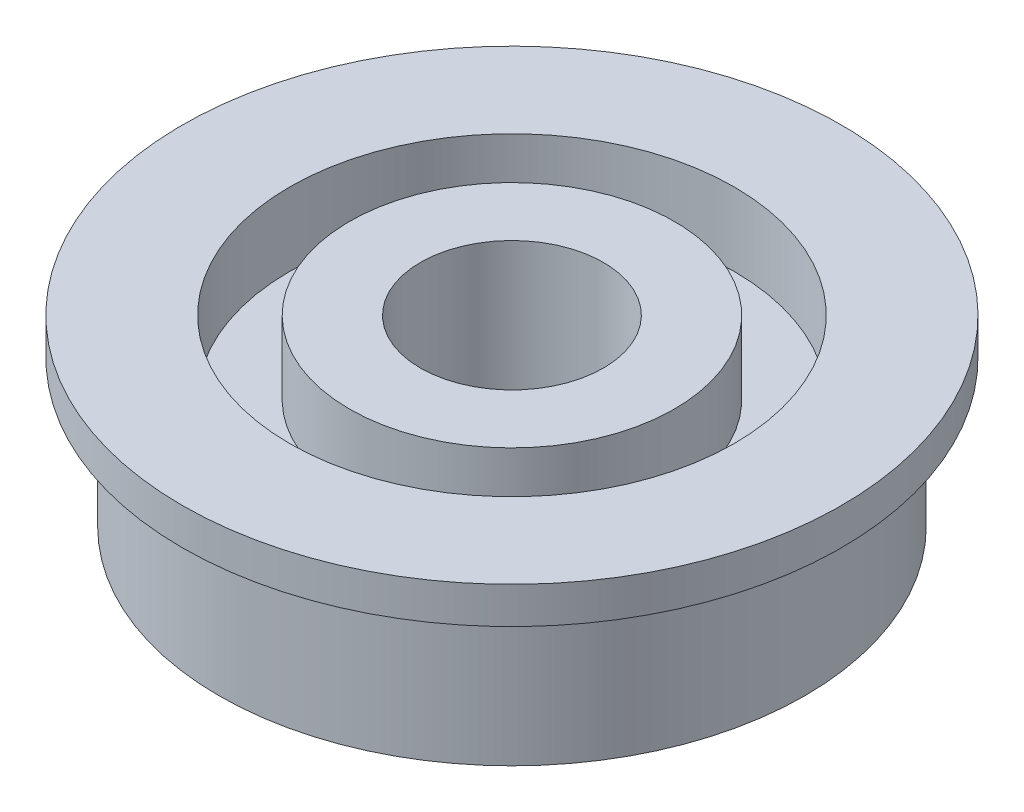
ISO-10303-21;
HEADER;
FILE_DESCRIPTION(('STEP AP214'),'2;1');
FILE_NAME('part.step','',(''),(''),'','','');
FILE_SCHEMA(('AUTOMOTIVE_DESIGN { 1 0 10303 214 1 1 1 1 }'));
ENDSEC;
DATA;
#1=APPLICATION_CONTEXT('core data for automotive mechanical design processes');
#2=APPLICATION_PROTOCOL_DEFINITION('international standard','automotive_design',2000,#1);
#3=PRODUCT_CONTEXT('',#1,'mechanical');
#4=PRODUCT('Part','Part','',(#3));
#5=PRODUCT_RELATED_PRODUCT_CATEGORY('part','',(#4));
#6=PRODUCT_DEFINITION_FORMATION('','',#4);
#7=PRODUCT_DEFINITION_CONTEXT('part definition',#1,'design');
#8=PRODUCT_DEFINITION('design','',#6,#7);
#9=PRODUCT_DEFINITION_SHAPE('','',#8);
#10=(LENGTH_UNIT() NAMED_UNIT(*) SI_UNIT(.MILLI.,.METRE.));
#11=(NAMED_UNIT(*) PLANE_ANGLE_UNIT() SI_UNIT($,.RADIAN.));
#12=(NAMED_UNIT(*) SI_UNIT($,.STERADIAN.) SOLID_ANGLE_UNIT());
#13=UNCERTAINTY_MEASURE_WITH_UNIT(LENGTH_MEASURE(1.E-05),#10,'distance_accuracy_value','');
#14=(GEOMETRIC_REPRESENTATION_CONTEXT(3) GLOBAL_UNCERTAINTY_ASSIGNED_CONTEXT((#13)) GLOBAL_UNIT_ASSIGNED_CONTEXT((#10,
#11,#12)) REPRESENTATION_CONTEXT('',''));
#15=CARTESIAN_POINT('',(0.,0.,0.));
#16=DIRECTION('',(0.,0.,1.));
#17=DIRECTION('',(1.,0.,0.));
#18=AXIS2_PLACEMENT_3D('',#15,#16,#17);
#19=CARTESIAN_POINT('',(0.,5.,0.));
#20=DIRECTION('',(0.,1.,0.));
#21=DIRECTION('',(0.,0.,1.));
#22=AXIS2_PLACEMENT_3D('',#19,#20,#21);
#23=PLANE('',#22);
#24=CARTESIAN_POINT('',(0.,5.,0.));
#25=DIRECTION('',(0.,1.,0.));
#26=DIRECTION('',(0.,0.,1.));
#27=AXIS2_PLACEMENT_3D('',#24,#25,#26);
#28=CIRCLE('',#27,2.5);
#29=CARTESIAN_POINT('',(0.,5.,2.5));
#30=VERTEX_POINT('',#29);
#31=EDGE_CURVE('E51',#30,#30,#28,.T.);
#32=ORIENTED_EDGE('',*,*,#31,.F.);
#33=EDGE_LOOP('',(#32));
#34=FACE_BOUND('',#33,.T.);
#35=CARTESIAN_POINT('',(0.,5.,0.));
#36=DIRECTION('',(0.,1.,0.));
#37=DIRECTION('',(0.,0.,1.));
#38=AXIS2_PLACEMENT_3D('',#35,#36,#37);
#39=CIRCLE('',#38,4.43730614042602);
#40=CARTESIAN_POINT('',(0.,5.,4.43730614042602));
#41=VERTEX_POINT('',#40);
#42=EDGE_CURVE('E75',#41,#41,#39,.T.);
#43=ORIENTED_EDGE('',*,*,#42,.T.);
#44=EDGE_LOOP('',(#43));
#45=FACE_BOUND('',#44,.T.);
#46=ADVANCED_FACE('F32',(#34,#45),#23,.T.);
#47=CARTESIAN_POINT('',(0.,0.,0.));
#48=DIRECTION('',(0.,1.,0.));
#49=DIRECTION('',(0.,0.,1.));
#50=AXIS2_PLACEMENT_3D('',#47,#48,#49);
#51=PLANE('',#50);
#52=CARTESIAN_POINT('',(0.,0.,0.));
#53=DIRECTION('',(0.,1.,0.));
#54=DIRECTION('',(0.,0.,1.));
#55=AXIS2_PLACEMENT_3D('',#52,#53,#54);
#56=CIRCLE('',#55,2.5);
#57=CARTESIAN_POINT('',(0.,0.,2.5));
#58=VERTEX_POINT('',#57);
#59=EDGE_CURVE('E43',#58,#58,#56,.T.);
#60=ORIENTED_EDGE('',*,*,#59,.T.);
#61=EDGE_LOOP('',(#60));
#62=FACE_BOUND('',#61,.T.);
#63=CARTESIAN_POINT('',(0.,0.,0.));
#64=DIRECTION('',(0.,-1.,0.));
#65=DIRECTION('',(0.,0.,-1.));
#66=AXIS2_PLACEMENT_3D('',#63,#64,#65);
#67=CIRCLE('',#66,4.35508581994814);
#68=CARTESIAN_POINT('',(0.,0.,-4.35508581994814));
#69=VERTEX_POINT('',#68);
#70=EDGE_CURVE('E63',#69,#69,#67,.T.);
#71=ORIENTED_EDGE('',*,*,#70,.T.);
#72=EDGE_LOOP('',(#71));
#73=FACE_BOUND('',#72,.T.);
#74=ADVANCED_FACE('F120',(#62,#73),#51,.F.);
#75=CARTESIAN_POINT('',(0.,0.,0.));
#76=DIRECTION('',(0.,-1.,0.));
#77=DIRECTION('',(0.,0.,-1.));
#78=AXIS2_PLACEMENT_3D('',#75,#76,#77);
#79=CIRCLE('',#78,6.08426139940902);
#80=CARTESIAN_POINT('',(0.,0.,-6.08426139940902));
#81=VERTEX_POINT('',#80);
#82=EDGE_CURVE('E57',#81,#81,#79,.T.);
#83=ORIENTED_EDGE('',*,*,#82,.F.);
#84=EDGE_LOOP('',(#83));
#85=FACE_BOUND('',#84,.T.);
#86=CARTESIAN_POINT('',(0.,0.,0.));
#87=DIRECTION('',(0.,1.,0.));
#88=DIRECTION('',(0.,0.,1.));
#89=AXIS2_PLACEMENT_3D('',#86,#87,#88);
#90=CIRCLE('',#89,8.);
#91=CARTESIAN_POINT('',(0.,0.,8.));
#92=VERTEX_POINT('',#91);
#93=EDGE_CURVE('E36',#92,#92,#90,.T.);
#94=ORIENTED_EDGE('',*,*,#93,.F.);
#95=EDGE_LOOP('',(#94));
#96=FACE_BOUND('',#95,.T.);
#97=ADVANCED_FACE('F125',(#85,#96),#51,.F.);
#98=CARTESIAN_POINT('',(0.,4.,0.));
#99=DIRECTION('',(0.,-1.,0.));
#100=DIRECTION('',(0.,0.,-1.));
#101=AXIS2_PLACEMENT_3D('',#98,#99,#100);
#102=CYLINDRICAL_SURFACE('',#101,8.);
#103=CARTESIAN_POINT('',(0.,4.,0.));
#104=DIRECTION('',(0.,1.,0.));
#105=DIRECTION('',(0.,0.,1.));
#106=AXIS2_PLACEMENT_3D('',#103,#104,#105);
#107=CIRCLE('',#106,8.);
#108=CARTESIAN_POINT('',(0.,4.,8.));
#109=VERTEX_POINT('',#108);
#110=EDGE_CURVE('E10',#109,#109,#107,.T.);
#111=ORIENTED_EDGE('',*,*,#110,.F.);
#112=EDGE_LOOP('',(#111));
#113=FACE_BOUND('',#112,.T.);
#114=ORIENTED_EDGE('',*,*,#93,.T.);
#115=EDGE_LOOP('',(#114));
#116=FACE_BOUND('',#115,.T.);
#117=ADVANCED_FACE('F34',(#113,#116),#102,.T.);
#118=CARTESIAN_POINT('',(0.,4.,0.));
#119=DIRECTION('',(0.,-1.,0.));
#120=DIRECTION('',(0.,0.,-1.));
#121=AXIS2_PLACEMENT_3D('',#118,#119,#120);
#122=CYLINDRICAL_SURFACE('',#121,2.5);
#123=ORIENTED_EDGE('',*,*,#59,.F.);
#124=EDGE_LOOP('',(#123));
#125=FACE_BOUND('',#124,.T.);
#126=ORIENTED_EDGE('',*,*,#31,.T.);
#127=EDGE_LOOP('',(#126));
#128=FACE_BOUND('',#127,.T.);
#129=ADVANCED_FACE('F112',(#125,#128),#122,.F.);
#130=CARTESIAN_POINT('',(0.,4.,0.));
#131=DIRECTION('',(0.,1.,0.));
#132=DIRECTION('',(0.,0.,1.));
#133=AXIS2_PLACEMENT_3D('',#130,#131,#132);
#134=PLANE('',#133);
#135=CARTESIAN_POINT('',(0.,4.,0.));
#136=DIRECTION('',(0.,1.,0.));
#137=DIRECTION('',(0.,0.,1.));
#138=AXIS2_PLACEMENT_3D('',#135,#136,#137);
#139=CIRCLE('',#138,9.);
#140=CARTESIAN_POINT('',(0.,4.,9.));
#141=VERTEX_POINT('',#140);
#142=EDGE_CURVE('E48',#141,#141,#139,.T.);
#143=ORIENTED_EDGE('',*,*,#142,.F.);
#144=EDGE_LOOP('',(#143));
#145=FACE_BOUND('',#144,.T.);
#146=ORIENTED_EDGE('',*,*,#110,.T.);
#147=EDGE_LOOP('',(#146));
#148=FACE_BOUND('',#147,.T.);
#149=ADVANCED_FACE('F101',(#145,#148),#134,.F.);
#150=CARTESIAN_POINT('',(0.,5.,0.));
#151=DIRECTION('',(0.,1.,0.));
#152=DIRECTION('',(0.,0.,1.));
#153=AXIS2_PLACEMENT_3D('',#150,#151,#152);
#154=CIRCLE('',#153,6.07006227775583);
#155=CARTESIAN_POINT('',(0.,5.,6.07006227775583));
#156=VERTEX_POINT('',#155);
#157=EDGE_CURVE('E69',#156,#156,#154,.T.);
#158=ORIENTED_EDGE('',*,*,#157,.F.);
#159=EDGE_LOOP('',(#158));
#160=FACE_BOUND('',#159,.T.);
#161=CARTESIAN_POINT('',(0.,5.,0.));
#162=DIRECTION('',(0.,1.,0.));
#163=DIRECTION('',(0.,0.,1.));
#164=AXIS2_PLACEMENT_3D('',#161,#162,#163);
#165=CIRCLE('',#164,9.);
#166=CARTESIAN_POINT('',(0.,5.,9.));
#167=VERTEX_POINT('',#166);
#168=EDGE_CURVE('E47',#167,#167,#165,.T.);
#169=ORIENTED_EDGE('',*,*,#168,.T.);
#170=EDGE_LOOP('',(#169));
#171=FACE_BOUND('',#170,.T.);
#172=ADVANCED_FACE('F97',(#160,#171),#23,.T.);
#173=CARTESIAN_POINT('',(0.,5.,0.));
#174=DIRECTION('',(0.,-1.,0.));
#175=DIRECTION('',(0.,0.,-1.));
#176=AXIS2_PLACEMENT_3D('',#173,#174,#175);
#177=CYLINDRICAL_SURFACE('',#176,9.);
#178=ORIENTED_EDGE('',*,*,#168,.F.);
#179=EDGE_LOOP('',(#178));
#180=FACE_BOUND('',#179,.T.);
#181=ORIENTED_EDGE('',*,*,#142,.T.);
#182=EDGE_LOOP('',(#181));
#183=FACE_BOUND('',#182,.T.);
#184=ADVANCED_FACE('F100',(#180,#183),#177,.T.);
#185=CARTESIAN_POINT('',(0.,1.,0.));
#186=DIRECTION('',(0.,-1.,0.));
#187=DIRECTION('',(0.,0.,-1.));
#188=AXIS2_PLACEMENT_3D('',#185,#186,#187);
#189=CYLINDRICAL_SURFACE('',#188,6.08426139940902);
#190=CARTESIAN_POINT('',(0.,1.,0.));
#191=DIRECTION('',(0.,-1.,0.));
#192=DIRECTION('',(0.,0.,-1.));
#193=AXIS2_PLACEMENT_3D('',#190,#191,#192);
#194=CIRCLE('',#193,6.08426139940902);
#195=CARTESIAN_POINT('',(0.,1.,-6.08426139940902));
#196=VERTEX_POINT('',#195);
#197=EDGE_CURVE('E56',#196,#196,#194,.T.);
#198=ORIENTED_EDGE('',*,*,#197,.F.);
#199=EDGE_LOOP('',(#198));
#200=FACE_BOUND('',#199,.T.);
#201=ORIENTED_EDGE('',*,*,#82,.T.);
#202=EDGE_LOOP('',(#201));
#203=FACE_BOUND('',#202,.T.);
#204=ADVANCED_FACE('F107',(#200,#203),#189,.F.);
#205=CARTESIAN_POINT('',(0.,1.,0.));
#206=DIRECTION('',(0.,-1.,0.));
#207=DIRECTION('',(0.,0.,-1.));
#208=AXIS2_PLACEMENT_3D('',#205,#206,#207);
#209=PLANE('',#208);
#210=CARTESIAN_POINT('',(0.,1.,0.));
#211=DIRECTION('',(0.,-1.,0.));
#212=DIRECTION('',(0.,0.,-1.));
#213=AXIS2_PLACEMENT_3D('',#210,#211,#212);
#214=CIRCLE('',#213,4.35508581994814);
#215=CARTESIAN_POINT('',(0.,1.,-4.35508581994814));
#216=VERTEX_POINT('',#215);
#217=EDGE_CURVE('E60',#216,#216,#214,.T.);
#218=ORIENTED_EDGE('',*,*,#217,.F.);
#219=EDGE_LOOP('',(#218));
#220=FACE_BOUND('',#219,.T.);
#221=ORIENTED_EDGE('',*,*,#197,.T.);
#222=EDGE_LOOP('',(#221));
#223=FACE_BOUND('',#222,.T.);
#224=ADVANCED_FACE('F132',(#220,#223),#209,.T.);
#225=CARTESIAN_POINT('',(0.,1.,0.));
#226=DIRECTION('',(0.,-1.,0.));
#227=DIRECTION('',(0.,0.,-1.));
#228=AXIS2_PLACEMENT_3D('',#225,#226,#227);
#229=CYLINDRICAL_SURFACE('',#228,4.35508581994814);
#230=ORIENTED_EDGE('',*,*,#217,.T.);
#231=EDGE_LOOP('',(#230));
#232=FACE_BOUND('',#231,.T.);
#233=ORIENTED_EDGE('',*,*,#70,.F.);
#234=EDGE_LOOP('',(#233));
#235=FACE_BOUND('',#234,.T.);
#236=ADVANCED_FACE('F93',(#232,#235),#229,.T.);
#237=CARTESIAN_POINT('',(0.,3.,0.));
#238=DIRECTION('',(0.,1.,0.));
#239=DIRECTION('',(0.,0.,1.));
#240=AXIS2_PLACEMENT_3D('',#237,#238,#239);
#241=CYLINDRICAL_SURFACE('',#240,6.07006227775583);
#242=CARTESIAN_POINT('',(0.,3.,0.));
#243=DIRECTION('',(0.,1.,0.));
#244=DIRECTION('',(0.,0.,1.));
#245=AXIS2_PLACEMENT_3D('',#242,#243,#244);
#246=CIRCLE('',#245,6.07006227775583);
#247=CARTESIAN_POINT('',(0.,3.,6.07006227775583));
#248=VERTEX_POINT('',#247);
#249=EDGE_CURVE('E66',#248,#248,#246,.T.);
#250=ORIENTED_EDGE('',*,*,#249,.F.);
#251=EDGE_LOOP('',(#250));
#252=FACE_BOUND('',#251,.T.);
#253=ORIENTED_EDGE('',*,*,#157,.T.);
#254=EDGE_LOOP('',(#253));
#255=FACE_BOUND('',#254,.T.);
#256=ADVANCED_FACE('F87',(#252,#255),#241,.F.);
#257=CARTESIAN_POINT('',(0.,3.,0.));
#258=DIRECTION('',(0.,1.,0.));
#259=DIRECTION('',(0.,0.,1.));
#260=AXIS2_PLACEMENT_3D('',#257,#258,#259);
#261=PLANE('',#260);
#262=CARTESIAN_POINT('',(0.,3.,0.));
#263=DIRECTION('',(0.,1.,0.));
#264=DIRECTION('',(0.,0.,1.));
#265=AXIS2_PLACEMENT_3D('',#262,#263,#264);
#266=CIRCLE('',#265,4.43730614042602);
#267=CARTESIAN_POINT('',(0.,3.,4.43730614042602));
#268=VERTEX_POINT('',#267);
#269=EDGE_CURVE('E72',#268,#268,#266,.T.);
#270=ORIENTED_EDGE('',*,*,#269,.F.);
#271=EDGE_LOOP('',(#270));
#272=FACE_BOUND('',#271,.T.);
#273=ORIENTED_EDGE('',*,*,#249,.T.);
#274=EDGE_LOOP('',(#273));
#275=FACE_BOUND('',#274,.T.);
#276=ADVANCED_FACE('F84',(#272,#275),#261,.T.);
#277=CARTESIAN_POINT('',(0.,3.,0.));
#278=DIRECTION('',(0.,1.,0.));
#279=DIRECTION('',(0.,0.,1.));
#280=AXIS2_PLACEMENT_3D('',#277,#278,#279);
#281=CYLINDRICAL_SURFACE('',#280,4.43730614042602);
#282=ORIENTED_EDGE('',*,*,#269,.T.);
#283=EDGE_LOOP('',(#282));
#284=FACE_BOUND('',#283,.T.);
#285=ORIENTED_EDGE('',*,*,#42,.F.);
#286=EDGE_LOOP('',(#285));
#287=FACE_BOUND('',#286,.T.);
#288=ADVANCED_FACE('F81',(#284,#287),#281,.T.);
#289=CLOSED_SHELL('',(#46,#74,#97,#117,#129,#149,#172,#184,#204,#224,#236,#256,#276,#288));
#290=MANIFOLD_SOLID_BREP('B2',#289);
#291=ADVANCED_BREP_SHAPE_REPRESENTATION('',(#18,#290),#14);
#292=SHAPE_DEFINITION_REPRESENTATION(#9,#291);
ENDSEC;
END-ISO-10303-21;
